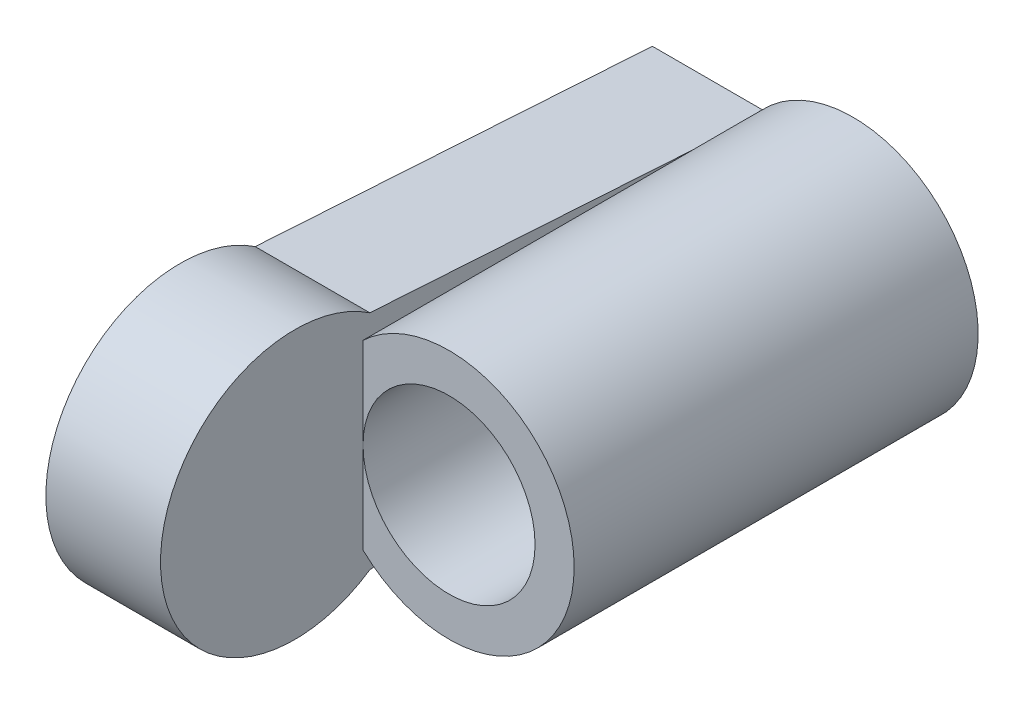
ISO-10303-21;
HEADER;
FILE_DESCRIPTION(('STEP AP214'),'2;1');
FILE_NAME('part.step','',(''),(''),'','','');
FILE_SCHEMA(('AUTOMOTIVE_DESIGN { 1 0 10303 214 1 1 1 1 }'));
ENDSEC;
DATA;
#1=APPLICATION_CONTEXT('core data for automotive mechanical design processes');
#2=APPLICATION_PROTOCOL_DEFINITION('international standard','automotive_design',2000,#1);
#3=PRODUCT_CONTEXT('',#1,'mechanical');
#4=PRODUCT('Part','Part','',(#3));
#5=PRODUCT_RELATED_PRODUCT_CATEGORY('part','',(#4));
#6=PRODUCT_DEFINITION_FORMATION('','',#4);
#7=PRODUCT_DEFINITION_CONTEXT('part definition',#1,'design');
#8=PRODUCT_DEFINITION('design','',#6,#7);
#9=PRODUCT_DEFINITION_SHAPE('','',#8);
#10=(LENGTH_UNIT() NAMED_UNIT(*) SI_UNIT(.MILLI.,.METRE.));
#11=(NAMED_UNIT(*) PLANE_ANGLE_UNIT() SI_UNIT($,.RADIAN.));
#12=(NAMED_UNIT(*) SI_UNIT($,.STERADIAN.) SOLID_ANGLE_UNIT());
#13=UNCERTAINTY_MEASURE_WITH_UNIT(LENGTH_MEASURE(1.E-05),#10,'distance_accuracy_value','');
#14=(GEOMETRIC_REPRESENTATION_CONTEXT(3) GLOBAL_UNCERTAINTY_ASSIGNED_CONTEXT((#13)) GLOBAL_UNIT_ASSIGNED_CONTEXT((#10,
#11,#12)) REPRESENTATION_CONTEXT('',''));
#15=CARTESIAN_POINT('',(0.,0.,0.));
#16=DIRECTION('',(0.,0.,1.));
#17=DIRECTION('',(1.,0.,0.));
#18=AXIS2_PLACEMENT_3D('',#15,#16,#17);
#19=CARTESIAN_POINT('',(7.7,0.,-2.61876961833622));
#20=DIRECTION('',(0.,0.,-1.));
#21=DIRECTION('',(-1.,0.,0.));
#22=AXIS2_PLACEMENT_3D('',#19,#20,#21);
#23=CYLINDRICAL_SURFACE('',#22,3.3);
#24=CARTESIAN_POINT('',(7.7,0.,-2.61876961833622));
#25=DIRECTION('',(0.,0.,-1.));
#26=DIRECTION('',(-1.,0.,0.));
#27=AXIS2_PLACEMENT_3D('',#24,#25,#26);
#28=CIRCLE('',#27,3.3);
#29=CARTESIAN_POINT('',(4.4,0.,-2.61876961833622));
#30=VERTEX_POINT('',#29);
#31=EDGE_CURVE('E234',#30,#30,#28,.T.);
#32=ORIENTED_EDGE('',*,*,#31,.F.);
#33=EDGE_LOOP('',(#32));
#34=FACE_BOUND('',#33,.T.);
#35=CARTESIAN_POINT('',(7.7,0.,-16.6187696183362));
#36=DIRECTION('',(0.,0.,-1.));
#37=DIRECTION('',(-1.,0.,0.));
#38=AXIS2_PLACEMENT_3D('',#35,#36,#37);
#39=CIRCLE('',#38,3.3);
#40=CARTESIAN_POINT('',(4.4,0.,-16.6187696183362));
#41=VERTEX_POINT('',#40);
#42=EDGE_CURVE('E11',#41,#41,#39,.F.);
#43=ORIENTED_EDGE('',*,*,#42,.F.);
#44=EDGE_LOOP('',(#43));
#45=FACE_BOUND('',#44,.T.);
#46=ADVANCED_FACE('F39',(#34,#45),#23,.F.);
#47=CARTESIAN_POINT('',(0.,0.,0.));
#48=DIRECTION('',(1.,0.,0.));
#49=DIRECTION('',(0.,0.,-1.));
#50=AXIS2_PLACEMENT_3D('',#47,#48,#49);
#51=PLANE('',#50);
#52=CARTESIAN_POINT('',(0.,0.,0.));
#53=DIRECTION('',(1.,0.,0.));
#54=DIRECTION('',(0.,0.,-1.));
#55=AXIS2_PLACEMENT_3D('',#52,#53,#54);
#56=CIRCLE('',#55,5.15);
#57=CARTESIAN_POINT('',(0.,4.26890958460167,-2.88078304606508));
#58=VERTEX_POINT('',#57);
#59=CARTESIAN_POINT('',(0.,-4.26890958460167,-2.88078304606508));
#60=VERTEX_POINT('',#59);
#61=EDGE_CURVE('E128',#58,#60,#56,.T.);
#62=ORIENTED_EDGE('',*,*,#61,.F.);
#63=DIRECTION('',(0.,0.0630714130950155,0.998009016417286));
#64=VECTOR('',#63,1.);
#65=CARTESIAN_POINT('',(0.,4.26890958460167,-2.88078304606508));
#66=LINE('',#65,#64);
#67=CARTESIAN_POINT('',(0.,3.3059109242427,-18.1187696183362));
#68=VERTEX_POINT('',#67);
#69=EDGE_CURVE('E206',#68,#58,#66,.T.);
#70=ORIENTED_EDGE('',*,*,#69,.F.);
#71=DIRECTION('',(0.,1.,0.));
#72=VECTOR('',#71,1.);
#73=CARTESIAN_POINT('',(0.,3.3059109242427,-18.1187696183362));
#74=LINE('',#73,#72);
#75=CARTESIAN_POINT('',(0.,-3.3059109242427,-18.1187696183362));
#76=VERTEX_POINT('',#75);
#77=EDGE_CURVE('E202',#76,#68,#74,.T.);
#78=ORIENTED_EDGE('',*,*,#77,.F.);
#79=DIRECTION('',(0.,0.0630714130950155,-0.998009016417286));
#80=VECTOR('',#79,1.);
#81=CARTESIAN_POINT('',(0.,-3.64701352462593,-12.7213406723096));
#82=LINE('',#81,#80);
#83=EDGE_CURVE('E199',#60,#76,#82,.T.);
#84=ORIENTED_EDGE('',*,*,#83,.F.);
#85=EDGE_LOOP('',(#62,#70,#78,#84));
#86=FACE_BOUND('',#85,.T.);
#87=CARTESIAN_POINT('',(0.,0.,0.));
#88=DIRECTION('',(1.,0.,0.));
#89=DIRECTION('',(0.,0.,-1.));
#90=AXIS2_PLACEMENT_3D('',#87,#88,#89);
#91=CIRCLE('',#90,3.65);
#92=CARTESIAN_POINT('',(0.,2.8,-2.34147389479362));
#93=VERTEX_POINT('',#92);
#94=CARTESIAN_POINT('',(0.,-2.8,-2.34147389479362));
#95=VERTEX_POINT('',#94);
#96=EDGE_CURVE('E151',#93,#95,#91,.T.);
#97=ORIENTED_EDGE('',*,*,#96,.T.);
#98=DIRECTION('',(0.,0.0630714130950155,-0.998009016417286));
#99=VECTOR('',#98,1.);
#100=CARTESIAN_POINT('',(0.,-2.15,-12.6267335526671));
#101=LINE('',#100,#99);
#102=CARTESIAN_POINT('',(0.,-1.89771434761994,-16.6187696183362));
#103=VERTEX_POINT('',#102);
#104=EDGE_CURVE('E172',#95,#103,#101,.T.);
#105=ORIENTED_EDGE('',*,*,#104,.T.);
#106=DIRECTION('',(0.,1.,0.));
#107=VECTOR('',#106,1.);
#108=CARTESIAN_POINT('',(0.,1.89771434761994,-16.6187696183362));
#109=LINE('',#108,#107);
#110=CARTESIAN_POINT('',(0.,1.89771434761994,-16.6187696183362));
#111=VERTEX_POINT('',#110);
#112=EDGE_CURVE('E176',#103,#111,#109,.T.);
#113=ORIENTED_EDGE('',*,*,#112,.T.);
#114=DIRECTION('',(0.,0.0630714130950155,0.998009016417286));
#115=VECTOR('',#114,1.);
#116=CARTESIAN_POINT('',(0.,2.8,-2.34147389479362));
#117=LINE('',#116,#115);
#118=EDGE_CURVE('E157',#111,#93,#117,.T.);
#119=ORIENTED_EDGE('',*,*,#118,.T.);
#120=EDGE_LOOP('',(#97,#105,#113,#119));
#121=FACE_BOUND('',#120,.T.);
#122=ADVANCED_FACE('F276',(#86,#121),#51,.F.);
#123=CARTESIAN_POINT('',(3.,0.,0.));
#124=DIRECTION('',(-1.,0.,0.));
#125=DIRECTION('',(0.,0.,1.));
#126=AXIS2_PLACEMENT_3D('',#123,#124,#125);
#127=CYLINDRICAL_SURFACE('',#126,5.15);
#128=ORIENTED_EDGE('',*,*,#61,.T.);
#129=DIRECTION('',(-1.,0.,0.));
#130=VECTOR('',#129,1.);
#131=CARTESIAN_POINT('',(3.,-4.26890958460167,-2.88078304606508));
#132=LINE('',#131,#130);
#133=CARTESIAN_POINT('',(4.4,-4.26890958460167,-2.88078304606508));
#134=VERTEX_POINT('',#133);
#135=EDGE_CURVE('E122',#134,#60,#132,.T.);
#136=ORIENTED_EDGE('',*,*,#135,.F.);
#137=CARTESIAN_POINT('',(4.4,0.,0.));
#138=DIRECTION('',(1.,0.,0.));
#139=DIRECTION('',(0.,0.,-1.));
#140=AXIS2_PLACEMENT_3D('',#137,#138,#139);
#141=CIRCLE('',#140,5.15);
#142=CARTESIAN_POINT('',(4.4,4.26890958460167,-2.88078304606508));
#143=VERTEX_POINT('',#142);
#144=EDGE_CURVE('E126',#143,#134,#141,.T.);
#145=ORIENTED_EDGE('',*,*,#144,.F.);
#146=DIRECTION('',(-1.,0.,0.));
#147=VECTOR('',#146,1.);
#148=CARTESIAN_POINT('',(3.,4.26890958460167,-2.88078304606508));
#149=LINE('',#148,#147);
#150=EDGE_CURVE('E209',#143,#58,#149,.T.);
#151=ORIENTED_EDGE('',*,*,#150,.T.);
#152=EDGE_LOOP('',(#128,#136,#145,#151));
#153=FACE_BOUND('',#152,.T.);
#154=ADVANCED_FACE('F41',(#153),#127,.T.);
#155=CARTESIAN_POINT('',(3.,-3.64701352462593,-12.7213406723096));
#156=DIRECTION('',(0.,0.998009016417286,0.0630714130950155));
#157=DIRECTION('',(0.,-0.0630714130950155,0.998009016417286));
#158=AXIS2_PLACEMENT_3D('',#155,#156,#157);
#159=PLANE('',#158);
#160=DIRECTION('',(-1.,0.,0.));
#161=VECTOR('',#160,1.);
#162=CARTESIAN_POINT('',(3.,-3.3059109242427,-18.1187696183362));
#163=LINE('',#162,#161);
#164=CARTESIAN_POINT('',(4.21992055249126,-3.3059109242427,-18.1187696183362));
#165=VERTEX_POINT('',#164);
#166=EDGE_CURVE('E55',#165,#76,#163,.T.);
#167=ORIENTED_EDGE('',*,*,#166,.F.);
#168=CARTESIAN_POINT('',(7.7,0.,-70.4297730977773));
#169=DIRECTION('',(0.,0.998009016417286,0.0630714130950155));
#170=DIRECTION('',(0.,0.0630714130950155,-0.998009016417286));
#171=AXIS2_PLACEMENT_3D('',#168,#169,#170);
#172=ELLIPSE('',#171,76.1042089348612,4.8);
#173=CARTESIAN_POINT('',(4.4,-3.48568501158668,-15.2741185905055));
#174=VERTEX_POINT('',#173);
#175=EDGE_CURVE('E135',#165,#174,#172,.T.);
#176=ORIENTED_EDGE('',*,*,#175,.T.);
#177=DIRECTION('',(0.,0.0630714130950155,-0.998009016417286));
#178=VECTOR('',#177,1.);
#179=CARTESIAN_POINT('',(4.4,-4.26890958460167,-2.88078304606508));
#180=LINE('',#179,#178);
#181=EDGE_CURVE('E133',#134,#174,#180,.T.);
#182=ORIENTED_EDGE('',*,*,#181,.F.);
#183=ORIENTED_EDGE('',*,*,#135,.T.);
#184=ORIENTED_EDGE('',*,*,#83,.T.);
#185=EDGE_LOOP('',(#167,#176,#182,#183,#184));
#186=FACE_BOUND('',#185,.T.);
#187=ADVANCED_FACE('F134',(#186),#159,.F.);
#188=CARTESIAN_POINT('',(3.,3.3059109242427,-18.1187696183362));
#189=DIRECTION('',(0.,0.,1.));
#190=DIRECTION('',(1.,0.,0.));
#191=AXIS2_PLACEMENT_3D('',#188,#189,#190);
#192=PLANE('',#191);
#193=CARTESIAN_POINT('',(7.7,0.,-18.1187696183362));
#194=DIRECTION('',(0.,0.,-1.));
#195=DIRECTION('',(-1.,0.,0.));
#196=AXIS2_PLACEMENT_3D('',#193,#194,#195);
#197=CIRCLE('',#196,4.8);
#198=CARTESIAN_POINT('',(4.21992055249126,3.3059109242427,-18.1187696183362));
#199=VERTEX_POINT('',#198);
#200=EDGE_CURVE('E237',#199,#165,#197,.T.);
#201=ORIENTED_EDGE('',*,*,#200,.T.);
#202=ORIENTED_EDGE('',*,*,#166,.T.);
#203=ORIENTED_EDGE('',*,*,#77,.T.);
#204=DIRECTION('',(-1.,0.,0.));
#205=VECTOR('',#204,1.);
#206=CARTESIAN_POINT('',(3.,3.3059109242427,-18.1187696183362));
#207=LINE('',#206,#205);
#208=EDGE_CURVE('E212',#199,#68,#207,.T.);
#209=ORIENTED_EDGE('',*,*,#208,.F.);
#210=EDGE_LOOP('',(#201,#202,#203,#209));
#211=FACE_BOUND('',#210,.T.);
#212=CARTESIAN_POINT('',(7.7,0.,-18.1187696183362));
#213=DIRECTION('',(0.,0.,-1.));
#214=DIRECTION('',(-1.,0.,0.));
#215=AXIS2_PLACEMENT_3D('',#212,#213,#214);
#216=CIRCLE('',#215,1.65);
#217=CARTESIAN_POINT('',(6.05,0.,-18.1187696183362));
#218=VERTEX_POINT('',#217);
#219=EDGE_CURVE('E247',#218,#218,#216,.T.);
#220=ORIENTED_EDGE('',*,*,#219,.F.);
#221=EDGE_LOOP('',(#220));
#222=FACE_BOUND('',#221,.T.);
#223=ADVANCED_FACE('F264',(#211,#222),#192,.F.);
#224=CARTESIAN_POINT('',(3.,4.26890958460167,-2.88078304606508));
#225=DIRECTION('',(0.,-0.998009016417286,0.0630714130950155));
#226=DIRECTION('',(0.,-0.0630714130950155,-0.998009016417286));
#227=AXIS2_PLACEMENT_3D('',#224,#225,#226);
#228=PLANE('',#227);
#229=DIRECTION('',(0.,0.0630714130950155,0.998009016417286));
#230=VECTOR('',#229,1.);
#231=CARTESIAN_POINT('',(4.4,3.3059109242427,-18.1187696183362));
#232=LINE('',#231,#230);
#233=CARTESIAN_POINT('',(4.4,3.48568501158667,-15.2741185905056));
#234=VERTEX_POINT('',#233);
#235=EDGE_CURVE('E139',#234,#143,#232,.T.);
#236=ORIENTED_EDGE('',*,*,#235,.F.);
#237=CARTESIAN_POINT('',(7.7,0.,-70.4297730977773));
#238=DIRECTION('',(0.,-0.998009016417286,0.0630714130950155));
#239=DIRECTION('',(0.,-0.0630714130950155,-0.998009016417286));
#240=AXIS2_PLACEMENT_3D('',#237,#238,#239);
#241=ELLIPSE('',#240,76.1042089348612,4.8);
#242=EDGE_CURVE('E63',#234,#199,#241,.T.);
#243=ORIENTED_EDGE('',*,*,#242,.T.);
#244=ORIENTED_EDGE('',*,*,#208,.T.);
#245=ORIENTED_EDGE('',*,*,#69,.T.);
#246=ORIENTED_EDGE('',*,*,#150,.F.);
#247=EDGE_LOOP('',(#236,#243,#244,#245,#246));
#248=FACE_BOUND('',#247,.T.);
#249=ADVANCED_FACE('F266',(#248),#228,.F.);
#250=CARTESIAN_POINT('',(3.,0.,0.));
#251=DIRECTION('',(-1.,0.,0.));
#252=DIRECTION('',(0.,0.,1.));
#253=AXIS2_PLACEMENT_3D('',#250,#251,#252);
#254=CYLINDRICAL_SURFACE('',#253,3.65);
#255=ORIENTED_EDGE('',*,*,#96,.F.);
#256=DIRECTION('',(-1.,0.,0.));
#257=VECTOR('',#256,1.);
#258=CARTESIAN_POINT('',(3.,2.8,-2.34147389479362));
#259=LINE('',#258,#257);
#260=CARTESIAN_POINT('',(3.,2.8,-2.34147389479362));
#261=VERTEX_POINT('',#260);
#262=EDGE_CURVE('E168',#261,#93,#259,.T.);
#263=ORIENTED_EDGE('',*,*,#262,.F.);
#264=CARTESIAN_POINT('',(3.,0.,0.));
#265=DIRECTION('',(1.,0.,0.));
#266=DIRECTION('',(0.,0.,-1.));
#267=AXIS2_PLACEMENT_3D('',#264,#265,#266);
#268=CIRCLE('',#267,3.65);
#269=CARTESIAN_POINT('',(3.,-2.8,-2.34147389479362));
#270=VERTEX_POINT('',#269);
#271=EDGE_CURVE('E152',#261,#270,#268,.T.);
#272=ORIENTED_EDGE('',*,*,#271,.T.);
#273=DIRECTION('',(-1.,0.,0.));
#274=VECTOR('',#273,1.);
#275=CARTESIAN_POINT('',(3.,-2.8,-2.34147389479362));
#276=LINE('',#275,#274);
#277=EDGE_CURVE('E193',#270,#95,#276,.T.);
#278=ORIENTED_EDGE('',*,*,#277,.T.);
#279=EDGE_LOOP('',(#255,#263,#272,#278));
#280=FACE_BOUND('',#279,.T.);
#281=ADVANCED_FACE('F273',(#280),#254,.F.);
#282=CARTESIAN_POINT('',(3.,-2.15,-12.6267335526671));
#283=DIRECTION('',(0.,0.998009016417285,0.0630714130950155));
#284=DIRECTION('',(0.,-0.0630714130950155,0.998009016417286));
#285=AXIS2_PLACEMENT_3D('',#282,#283,#284);
#286=PLANE('',#285);
#287=ORIENTED_EDGE('',*,*,#104,.F.);
#288=ORIENTED_EDGE('',*,*,#277,.F.);
#289=DIRECTION('',(0.,0.0630714130950155,-0.998009016417286));
#290=VECTOR('',#289,1.);
#291=CARTESIAN_POINT('',(3.,-2.8,-2.34147389479362));
#292=LINE('',#291,#290);
#293=CARTESIAN_POINT('',(3.,-1.89771434761994,-16.6187696183362));
#294=VERTEX_POINT('',#293);
#295=EDGE_CURVE('E156',#270,#294,#292,.T.);
#296=ORIENTED_EDGE('',*,*,#295,.T.);
#297=DIRECTION('',(-1.,0.,0.));
#298=VECTOR('',#297,1.);
#299=CARTESIAN_POINT('',(3.,-1.89771434761994,-16.6187696183362));
#300=LINE('',#299,#298);
#301=EDGE_CURVE('E190',#294,#103,#300,.T.);
#302=ORIENTED_EDGE('',*,*,#301,.T.);
#303=EDGE_LOOP('',(#287,#288,#296,#302));
#304=FACE_BOUND('',#303,.T.);
#305=ADVANCED_FACE('F305',(#304),#286,.T.);
#306=CARTESIAN_POINT('',(3.,1.89771434761994,-16.6187696183362));
#307=DIRECTION('',(0.,0.,1.));
#308=DIRECTION('',(1.,0.,0.));
#309=AXIS2_PLACEMENT_3D('',#306,#307,#308);
#310=PLANE('',#309);
#311=DIRECTION('',(0.,1.,0.));
#312=VECTOR('',#311,1.);
#313=CARTESIAN_POINT('',(3.,1.89771434761994,-16.6187696183362));
#314=LINE('',#313,#312);
#315=CARTESIAN_POINT('',(3.,1.89771434761994,-16.6187696183362));
#316=VERTEX_POINT('',#315);
#317=EDGE_CURVE('E161',#294,#316,#314,.T.);
#318=ORIENTED_EDGE('',*,*,#317,.T.);
#319=DIRECTION('',(-1.,0.,0.));
#320=VECTOR('',#319,1.);
#321=CARTESIAN_POINT('',(3.,1.89771434761994,-16.6187696183362));
#322=LINE('',#321,#320);
#323=EDGE_CURVE('E186',#316,#111,#322,.T.);
#324=ORIENTED_EDGE('',*,*,#323,.T.);
#325=ORIENTED_EDGE('',*,*,#112,.F.);
#326=ORIENTED_EDGE('',*,*,#301,.F.);
#327=EDGE_LOOP('',(#318,#324,#325,#326));
#328=FACE_BOUND('',#327,.T.);
#329=ADVANCED_FACE('F301',(#328),#310,.T.);
#330=CARTESIAN_POINT('',(3.,2.8,-2.34147389479362));
#331=DIRECTION('',(0.,-0.998009016417285,0.0630714130950155));
#332=DIRECTION('',(0.,-0.0630714130950155,-0.998009016417286));
#333=AXIS2_PLACEMENT_3D('',#330,#331,#332);
#334=PLANE('',#333);
#335=ORIENTED_EDGE('',*,*,#118,.F.);
#336=ORIENTED_EDGE('',*,*,#323,.F.);
#337=DIRECTION('',(0.,0.0630714130950155,0.998009016417286));
#338=VECTOR('',#337,1.);
#339=CARTESIAN_POINT('',(3.,2.15,-12.6267335526671));
#340=LINE('',#339,#338);
#341=EDGE_CURVE('E164',#316,#261,#340,.T.);
#342=ORIENTED_EDGE('',*,*,#341,.T.);
#343=ORIENTED_EDGE('',*,*,#262,.T.);
#344=EDGE_LOOP('',(#335,#336,#342,#343));
#345=FACE_BOUND('',#344,.T.);
#346=ADVANCED_FACE('F297',(#345),#334,.T.);
#347=CARTESIAN_POINT('',(3.,0.,0.));
#348=DIRECTION('',(1.,0.,0.));
#349=DIRECTION('',(0.,0.,-1.));
#350=AXIS2_PLACEMENT_3D('',#347,#348,#349);
#351=PLANE('',#350);
#352=ORIENTED_EDGE('',*,*,#341,.F.);
#353=ORIENTED_EDGE('',*,*,#317,.F.);
#354=ORIENTED_EDGE('',*,*,#295,.F.);
#355=ORIENTED_EDGE('',*,*,#271,.F.);
#356=EDGE_LOOP('',(#352,#353,#354,#355));
#357=FACE_BOUND('',#356,.T.);
#358=ADVANCED_FACE('F294',(#357),#351,.F.);
#359=CARTESIAN_POINT('',(4.4,0.,0.));
#360=DIRECTION('',(1.,0.,0.));
#361=DIRECTION('',(0.,0.,-1.));
#362=AXIS2_PLACEMENT_3D('',#359,#360,#361);
#363=PLANE('',#362);
#364=DIRECTION('',(0.,0.,-1.));
#365=VECTOR('',#364,1.);
#366=CARTESIAN_POINT('',(4.4,-3.48568501158668,-2.61876961833622));
#367=LINE('',#366,#365);
#368=CARTESIAN_POINT('',(4.4,-3.48568501158668,-2.61876961833622));
#369=VERTEX_POINT('',#368);
#370=EDGE_CURVE('E48',#369,#174,#367,.T.);
#371=ORIENTED_EDGE('',*,*,#370,.F.);
#372=DIRECTION('',(0.,1.,0.));
#373=VECTOR('',#372,1.);
#374=CARTESIAN_POINT('',(4.4,0.,-2.61876961833622));
#375=LINE('',#374,#373);
#376=EDGE_CURVE('E220',#369,#30,#375,.T.);
#377=ORIENTED_EDGE('',*,*,#376,.T.);
#378=CARTESIAN_POINT('',(4.4,3.48568501158668,-2.61876961833622));
#379=VERTEX_POINT('',#378);
#380=EDGE_CURVE('E130',#30,#379,#375,.T.);
#381=ORIENTED_EDGE('',*,*,#380,.T.);
#382=DIRECTION('',(0.,0.,-1.));
#383=VECTOR('',#382,1.);
#384=CARTESIAN_POINT('',(4.4,3.48568501158668,-2.61876961833622));
#385=LINE('',#384,#383);
#386=EDGE_CURVE('E219',#234,#379,#385,.F.);
#387=ORIENTED_EDGE('',*,*,#386,.F.);
#388=ORIENTED_EDGE('',*,*,#235,.T.);
#389=ORIENTED_EDGE('',*,*,#144,.T.);
#390=ORIENTED_EDGE('',*,*,#181,.T.);
#391=EDGE_LOOP('',(#371,#377,#381,#387,#388,#389,#390));
#392=FACE_BOUND('',#391,.T.);
#393=ADVANCED_FACE('F141',(#392),#363,.T.);
#394=CARTESIAN_POINT('',(7.7,0.,-2.61876961833622));
#395=DIRECTION('',(0.,0.,-1.));
#396=DIRECTION('',(-1.,0.,0.));
#397=AXIS2_PLACEMENT_3D('',#394,#395,#396);
#398=PLANE('',#397);
#399=ORIENTED_EDGE('',*,*,#376,.F.);
#400=CARTESIAN_POINT('',(7.7,0.,-2.61876961833622));
#401=DIRECTION('',(0.,0.,-1.));
#402=DIRECTION('',(-1.,0.,0.));
#403=AXIS2_PLACEMENT_3D('',#400,#401,#402);
#404=CIRCLE('',#403,4.8);
#405=EDGE_CURVE('E235',#379,#369,#404,.T.);
#406=ORIENTED_EDGE('',*,*,#405,.F.);
#407=ORIENTED_EDGE('',*,*,#380,.F.);
#408=ORIENTED_EDGE('',*,*,#31,.T.);
#409=EDGE_LOOP('',(#399,#406,#407,#408));
#410=FACE_BOUND('',#409,.T.);
#411=ADVANCED_FACE('F232',(#410),#398,.F.);
#412=CARTESIAN_POINT('',(7.7,0.,-2.61876961833622));
#413=DIRECTION('',(0.,0.,-1.));
#414=DIRECTION('',(-1.,0.,0.));
#415=AXIS2_PLACEMENT_3D('',#412,#413,#414);
#416=CYLINDRICAL_SURFACE('',#415,4.8);
#417=ORIENTED_EDGE('',*,*,#175,.F.);
#418=ORIENTED_EDGE('',*,*,#200,.F.);
#419=ORIENTED_EDGE('',*,*,#242,.F.);
#420=ORIENTED_EDGE('',*,*,#386,.T.);
#421=ORIENTED_EDGE('',*,*,#405,.T.);
#422=ORIENTED_EDGE('',*,*,#370,.T.);
#423=EDGE_LOOP('',(#417,#418,#419,#420,#421,#422));
#424=FACE_BOUND('',#423,.T.);
#425=ADVANCED_FACE('F289',(#424),#416,.T.);
#426=CARTESIAN_POINT('',(7.7,0.,-16.6187696183362));
#427=DIRECTION('',(0.,0.,-1.));
#428=DIRECTION('',(-1.,0.,0.));
#429=AXIS2_PLACEMENT_3D('',#426,#427,#428);
#430=PLANE('',#429);
#431=CARTESIAN_POINT('',(7.7,0.,-16.6187696183362));
#432=DIRECTION('',(0.,0.,-1.));
#433=DIRECTION('',(-1.,0.,0.));
#434=AXIS2_PLACEMENT_3D('',#431,#432,#433);
#435=CIRCLE('',#434,1.65);
#436=CARTESIAN_POINT('',(6.05,0.,-16.6187696183362));
#437=VERTEX_POINT('',#436);
#438=EDGE_CURVE('E246',#437,#437,#435,.T.);
#439=ORIENTED_EDGE('',*,*,#438,.T.);
#440=EDGE_LOOP('',(#439));
#441=FACE_BOUND('',#440,.T.);
#442=ORIENTED_EDGE('',*,*,#42,.T.);
#443=EDGE_LOOP('',(#442));
#444=FACE_BOUND('',#443,.T.);
#445=ADVANCED_FACE('F255',(#441,#444),#430,.F.);
#446=CARTESIAN_POINT('',(7.7,0.,-16.6187696183362));
#447=DIRECTION('',(0.,0.,-1.));
#448=DIRECTION('',(-1.,0.,0.));
#449=AXIS2_PLACEMENT_3D('',#446,#447,#448);
#450=CYLINDRICAL_SURFACE('',#449,1.65);
#451=ORIENTED_EDGE('',*,*,#438,.F.);
#452=EDGE_LOOP('',(#451));
#453=FACE_BOUND('',#452,.T.);
#454=ORIENTED_EDGE('',*,*,#219,.T.);
#455=EDGE_LOOP('',(#454));
#456=FACE_BOUND('',#455,.T.);
#457=ADVANCED_FACE('F258',(#453,#456),#450,.F.);
#458=CLOSED_SHELL('',(#46,#122,#154,#187,#223,#249,#281,#305,#329,#346,#358,#393,#411,#425,#445,#457));
#459=MANIFOLD_SOLID_BREP('B2',#458);
#460=ADVANCED_BREP_SHAPE_REPRESENTATION('',(#18,#459),#14);
#461=SHAPE_DEFINITION_REPRESENTATION(#9,#460);
ENDSEC;
END-ISO-10303-21;
